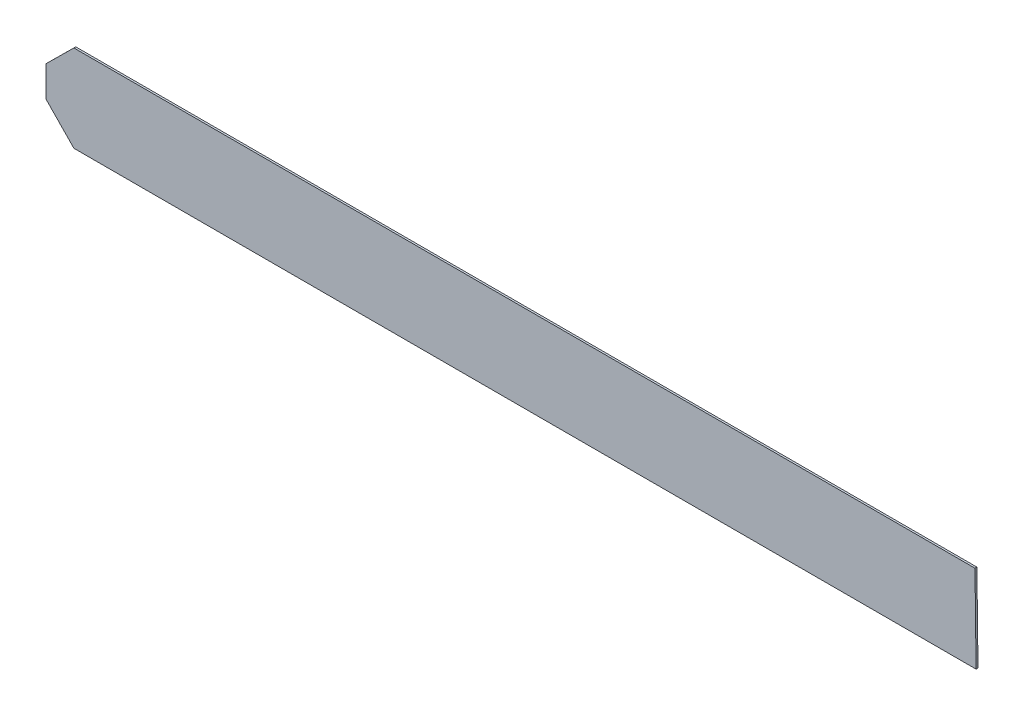
ISO-10303-21;
HEADER;
FILE_DESCRIPTION(('STEP AP214'),'2;1');
FILE_NAME('part.step','',(''),(''),'','','');
FILE_SCHEMA(('AUTOMOTIVE_DESIGN { 1 0 10303 214 1 1 1 1 }'));
ENDSEC;
DATA;
#1=APPLICATION_CONTEXT('core data for automotive mechanical design processes');
#2=APPLICATION_PROTOCOL_DEFINITION('international standard','automotive_design',2000,#1);
#3=PRODUCT_CONTEXT('',#1,'mechanical');
#4=PRODUCT('Part','Part','',(#3));
#5=PRODUCT_RELATED_PRODUCT_CATEGORY('part','',(#4));
#6=PRODUCT_DEFINITION_FORMATION('','',#4);
#7=PRODUCT_DEFINITION_CONTEXT('part definition',#1,'design');
#8=PRODUCT_DEFINITION('design','',#6,#7);
#9=PRODUCT_DEFINITION_SHAPE('','',#8);
#10=(LENGTH_UNIT() NAMED_UNIT(*) SI_UNIT(.MILLI.,.METRE.));
#11=(NAMED_UNIT(*) PLANE_ANGLE_UNIT() SI_UNIT($,.RADIAN.));
#12=(NAMED_UNIT(*) SI_UNIT($,.STERADIAN.) SOLID_ANGLE_UNIT());
#13=UNCERTAINTY_MEASURE_WITH_UNIT(LENGTH_MEASURE(1.E-05),#10,'distance_accuracy_value','');
#14=(GEOMETRIC_REPRESENTATION_CONTEXT(3) GLOBAL_UNCERTAINTY_ASSIGNED_CONTEXT((#13)) GLOBAL_UNIT_ASSIGNED_CONTEXT((#10,
#11,#12)) REPRESENTATION_CONTEXT('',''));
#15=CARTESIAN_POINT('',(0.,0.,0.));
#16=DIRECTION('',(0.,0.,1.));
#17=DIRECTION('',(1.,0.,0.));
#18=AXIS2_PLACEMENT_3D('',#15,#16,#17);
#19=CARTESIAN_POINT('',(4261.31622075554,285.009681153562,9.525));
#20=DIRECTION('',(-0.999919021581722,-0.0127259686881193,0.));
#21=DIRECTION('',(0.0127259686881193,-0.999919021581722,0.));
#22=AXIS2_PLACEMENT_3D('',#19,#20,#21);
#23=PLANE('',#22);
#24=DIRECTION('',(-0.0127259686881193,0.999919021581722,0.));
#25=VECTOR('',#24,1.);
#26=CARTESIAN_POINT('',(4261.31622075554,285.009681153562,0.));
#27=LINE('',#26,#25);
#28=CARTESIAN_POINT('',(4266.81173905345,-146.790318846438,0.));
#29=VERTEX_POINT('',#28);
#30=CARTESIAN_POINT('',(4261.31622075554,285.009681153562,0.));
#31=VERTEX_POINT('',#30);
#32=EDGE_CURVE('E117',#29,#31,#27,.T.);
#33=ORIENTED_EDGE('',*,*,#32,.T.);
#34=DIRECTION('',(0.,0.,-1.));
#35=VECTOR('',#34,1.);
#36=CARTESIAN_POINT('',(4261.31622075554,285.009681153562,9.525));
#37=LINE('',#36,#35);
#38=CARTESIAN_POINT('',(4261.31622075554,285.009681153562,9.525));
#39=VERTEX_POINT('',#38);
#40=EDGE_CURVE('E11',#39,#31,#37,.T.);
#41=ORIENTED_EDGE('',*,*,#40,.F.);
#42=DIRECTION('',(-0.0127259686881193,0.999919021581722,0.));
#43=VECTOR('',#42,1.);
#44=CARTESIAN_POINT('',(4261.31622075554,285.009681153562,9.525));
#45=LINE('',#44,#43);
#46=CARTESIAN_POINT('',(4266.81173905345,-146.790318846438,9.525));
#47=VERTEX_POINT('',#46);
#48=EDGE_CURVE('E127',#47,#39,#45,.T.);
#49=ORIENTED_EDGE('',*,*,#48,.F.);
#50=DIRECTION('',(0.,0.,-1.));
#51=VECTOR('',#50,1.);
#52=CARTESIAN_POINT('',(4266.81173905345,-146.790318846438,9.525));
#53=LINE('',#52,#51);
#54=EDGE_CURVE('E113',#47,#29,#53,.T.);
#55=ORIENTED_EDGE('',*,*,#54,.T.);
#56=EDGE_LOOP('',(#33,#41,#49,#55));
#57=FACE_BOUND('',#56,.T.);
#58=ADVANCED_FACE('F33',(#57),#23,.F.);
#59=CARTESIAN_POINT('',(-216.488062196188,285.009681153562,9.525));
#60=DIRECTION('',(0.,-1.,0.));
#61=DIRECTION('',(1.,0.,0.));
#62=AXIS2_PLACEMENT_3D('',#59,#60,#61);
#63=PLANE('',#62);
#64=DIRECTION('',(-1.,0.,0.));
#65=VECTOR('',#64,1.);
#66=CARTESIAN_POINT('',(-216.488062196188,285.009681153562,0.));
#67=LINE('',#66,#65);
#68=CARTESIAN_POINT('',(-216.488062196188,285.009681153562,0.));
#69=VERTEX_POINT('',#68);
#70=EDGE_CURVE('E120',#31,#69,#67,.T.);
#71=ORIENTED_EDGE('',*,*,#70,.T.);
#72=DIRECTION('',(0.,0.,-1.));
#73=VECTOR('',#72,1.);
#74=CARTESIAN_POINT('',(-216.488062196188,285.009681153562,9.525));
#75=LINE('',#74,#73);
#76=CARTESIAN_POINT('',(-216.488062196188,285.009681153562,9.525));
#77=VERTEX_POINT('',#76);
#78=EDGE_CURVE('E41',#77,#69,#75,.T.);
#79=ORIENTED_EDGE('',*,*,#78,.F.);
#80=DIRECTION('',(-1.,0.,0.));
#81=VECTOR('',#80,1.);
#82=CARTESIAN_POINT('',(-216.488062196188,285.009681153562,9.525));
#83=LINE('',#82,#81);
#84=EDGE_CURVE('E86',#39,#77,#83,.T.);
#85=ORIENTED_EDGE('',*,*,#84,.F.);
#86=ORIENTED_EDGE('',*,*,#40,.T.);
#87=EDGE_LOOP('',(#71,#79,#85,#86));
#88=FACE_BOUND('',#87,.T.);
#89=ADVANCED_FACE('F151',(#88),#63,.F.);
#90=CARTESIAN_POINT('',(-216.488062196188,285.009681153562,9.525));
#91=DIRECTION('',(0.703672127062564,-0.710524832497251,0.));
#92=DIRECTION('',(0.710524832497251,0.703672127062564,0.));
#93=AXIS2_PLACEMENT_3D('',#90,#91,#92);
#94=PLANE('',#93);
#95=DIRECTION('',(-0.710524832497251,-0.703672127062564,0.));
#96=VECTOR('',#95,1.);
#97=CARTESIAN_POINT('',(-216.488062196188,285.009681153562,0.));
#98=LINE('',#97,#96);
#99=CARTESIAN_POINT('',(-354.995654442996,147.837934871207,0.));
#100=VERTEX_POINT('',#99);
#101=EDGE_CURVE('E122',#69,#100,#98,.T.);
#102=ORIENTED_EDGE('',*,*,#101,.T.);
#103=DIRECTION('',(0.,0.,-1.));
#104=VECTOR('',#103,1.);
#105=CARTESIAN_POINT('',(-354.995654442996,147.837934871207,9.525));
#106=LINE('',#105,#104);
#107=CARTESIAN_POINT('',(-354.995654442996,147.837934871207,9.525));
#108=VERTEX_POINT('',#107);
#109=EDGE_CURVE('E108',#108,#100,#106,.T.);
#110=ORIENTED_EDGE('',*,*,#109,.F.);
#111=DIRECTION('',(-0.710524832497251,-0.703672127062564,0.));
#112=VECTOR('',#111,1.);
#113=CARTESIAN_POINT('',(-216.488062196188,285.009681153562,9.525));
#114=LINE('',#113,#112);
#115=EDGE_CURVE('E99',#77,#108,#114,.T.);
#116=ORIENTED_EDGE('',*,*,#115,.F.);
#117=ORIENTED_EDGE('',*,*,#78,.T.);
#118=EDGE_LOOP('',(#102,#110,#116,#117));
#119=FACE_BOUND('',#118,.T.);
#120=ADVANCED_FACE('F133',(#119),#94,.F.);
#121=CARTESIAN_POINT('',(-354.995654442996,147.837934871207,9.525));
#122=DIRECTION('',(1.,0.,0.));
#123=DIRECTION('',(0.,0.,-1.));
#124=AXIS2_PLACEMENT_3D('',#121,#122,#123);
#125=PLANE('',#124);
#126=DIRECTION('',(0.,-1.,0.));
#127=VECTOR('',#126,1.);
#128=CARTESIAN_POINT('',(-354.995654442996,147.837934871207,0.));
#129=LINE('',#128,#127);
#130=CARTESIAN_POINT('',(-354.995654442996,-4.56206512879289,0.));
#131=VERTEX_POINT('',#130);
#132=EDGE_CURVE('E107',#100,#131,#129,.T.);
#133=ORIENTED_EDGE('',*,*,#132,.T.);
#134=DIRECTION('',(0.,0.,-1.));
#135=VECTOR('',#134,1.);
#136=CARTESIAN_POINT('',(-354.995654442996,-4.56206512879289,9.525));
#137=LINE('',#136,#135);
#138=CARTESIAN_POINT('',(-354.995654442996,-4.56206512879289,9.525));
#139=VERTEX_POINT('',#138);
#140=EDGE_CURVE('E104',#139,#131,#137,.T.);
#141=ORIENTED_EDGE('',*,*,#140,.F.);
#142=DIRECTION('',(0.,-1.,0.));
#143=VECTOR('',#142,1.);
#144=CARTESIAN_POINT('',(-354.995654442996,147.837934871207,9.525));
#145=LINE('',#144,#143);
#146=EDGE_CURVE('E93',#108,#139,#145,.T.);
#147=ORIENTED_EDGE('',*,*,#146,.F.);
#148=ORIENTED_EDGE('',*,*,#109,.T.);
#149=EDGE_LOOP('',(#133,#141,#147,#148));
#150=FACE_BOUND('',#149,.T.);
#151=ADVANCED_FACE('F105',(#150),#125,.F.);
#152=CARTESIAN_POINT('',(-354.995654442996,-4.56206512879289,9.525));
#153=DIRECTION('',(0.716415326023721,0.697674050426362,0.));
#154=DIRECTION('',(-0.697674050426362,0.716415326023721,0.));
#155=AXIS2_PLACEMENT_3D('',#152,#153,#154);
#156=PLANE('',#155);
#157=DIRECTION('',(0.697674050426362,-0.716415326023721,0.));
#158=VECTOR('',#157,1.);
#159=CARTESIAN_POINT('',(-354.995654442996,-4.56206512879289,0.));
#160=LINE('',#159,#158);
#161=CARTESIAN_POINT('',(-216.488062196188,-146.790318846438,0.));
#162=VERTEX_POINT('',#161);
#163=EDGE_CURVE('E72',#131,#162,#160,.T.);
#164=ORIENTED_EDGE('',*,*,#163,.T.);
#165=DIRECTION('',(0.,0.,-1.));
#166=VECTOR('',#165,1.);
#167=CARTESIAN_POINT('',(-216.488062196188,-146.790318846438,9.525));
#168=LINE('',#167,#166);
#169=CARTESIAN_POINT('',(-216.488062196188,-146.790318846438,9.525));
#170=VERTEX_POINT('',#169);
#171=EDGE_CURVE('E109',#170,#162,#168,.T.);
#172=ORIENTED_EDGE('',*,*,#171,.F.);
#173=DIRECTION('',(0.697674050426362,-0.716415326023721,0.));
#174=VECTOR('',#173,1.);
#175=CARTESIAN_POINT('',(-354.995654442996,-4.56206512879289,9.525));
#176=LINE('',#175,#174);
#177=EDGE_CURVE('E97',#139,#170,#176,.T.);
#178=ORIENTED_EDGE('',*,*,#177,.F.);
#179=ORIENTED_EDGE('',*,*,#140,.T.);
#180=EDGE_LOOP('',(#164,#172,#178,#179));
#181=FACE_BOUND('',#180,.T.);
#182=ADVANCED_FACE('F111',(#181),#156,.F.);
#183=CARTESIAN_POINT('',(4266.81173905345,-146.790318846438,9.525));
#184=DIRECTION('',(0.,1.,0.));
#185=DIRECTION('',(-1.,0.,0.));
#186=AXIS2_PLACEMENT_3D('',#183,#184,#185);
#187=PLANE('',#186);
#188=DIRECTION('',(1.,0.,0.));
#189=VECTOR('',#188,1.);
#190=CARTESIAN_POINT('',(4266.81173905345,-146.790318846438,0.));
#191=LINE('',#190,#189);
#192=EDGE_CURVE('E78',#162,#29,#191,.T.);
#193=ORIENTED_EDGE('',*,*,#192,.T.);
#194=ORIENTED_EDGE('',*,*,#54,.F.);
#195=DIRECTION('',(1.,0.,0.));
#196=VECTOR('',#195,1.);
#197=CARTESIAN_POINT('',(4266.81173905345,-146.790318846438,9.525));
#198=LINE('',#197,#196);
#199=EDGE_CURVE('E49',#170,#47,#198,.T.);
#200=ORIENTED_EDGE('',*,*,#199,.F.);
#201=ORIENTED_EDGE('',*,*,#171,.T.);
#202=EDGE_LOOP('',(#193,#194,#200,#201));
#203=FACE_BOUND('',#202,.T.);
#204=ADVANCED_FACE('F140',(#203),#187,.F.);
#205=CARTESIAN_POINT('',(0.,0.,9.525));
#206=DIRECTION('',(0.,0.,-1.));
#207=DIRECTION('',(-1.,0.,0.));
#208=AXIS2_PLACEMENT_3D('',#205,#206,#207);
#209=PLANE('',#208);
#210=ORIENTED_EDGE('',*,*,#48,.T.);
#211=ORIENTED_EDGE('',*,*,#84,.T.);
#212=ORIENTED_EDGE('',*,*,#115,.T.);
#213=ORIENTED_EDGE('',*,*,#146,.T.);
#214=ORIENTED_EDGE('',*,*,#177,.T.);
#215=ORIENTED_EDGE('',*,*,#199,.T.);
#216=EDGE_LOOP('',(#210,#211,#212,#213,#214,#215));
#217=FACE_BOUND('',#216,.T.);
#218=ADVANCED_FACE('F95',(#217),#209,.F.);
#219=CARTESIAN_POINT('',(0.,0.,0.));
#220=DIRECTION('',(0.,0.,-1.));
#221=DIRECTION('',(-1.,0.,0.));
#222=AXIS2_PLACEMENT_3D('',#219,#220,#221);
#223=PLANE('',#222);
#224=ORIENTED_EDGE('',*,*,#32,.F.);
#225=ORIENTED_EDGE('',*,*,#192,.F.);
#226=ORIENTED_EDGE('',*,*,#163,.F.);
#227=ORIENTED_EDGE('',*,*,#132,.F.);
#228=ORIENTED_EDGE('',*,*,#101,.F.);
#229=ORIENTED_EDGE('',*,*,#70,.F.);
#230=EDGE_LOOP('',(#224,#225,#226,#227,#228,#229));
#231=FACE_BOUND('',#230,.T.);
#232=ADVANCED_FACE('F136',(#231),#223,.T.);
#233=CLOSED_SHELL('',(#58,#89,#120,#151,#182,#204,#218,#232));
#234=MANIFOLD_SOLID_BREP('B2',#233);
#235=ADVANCED_BREP_SHAPE_REPRESENTATION('',(#18,#234),#14);
#236=SHAPE_DEFINITION_REPRESENTATION(#9,#235);
ENDSEC;
END-ISO-10303-21;
